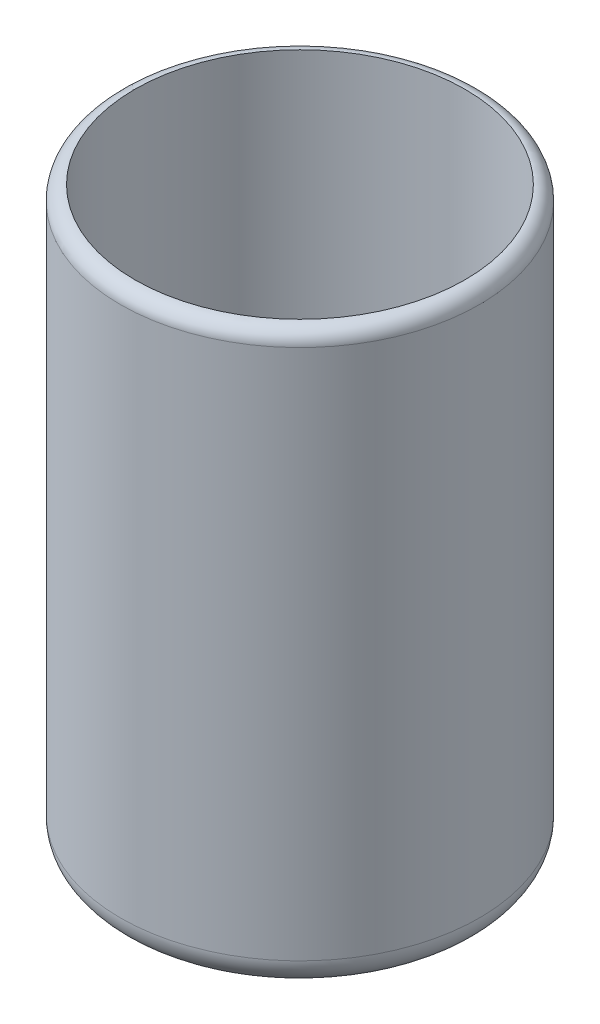
ISO-10303-21;
HEADER;
FILE_DESCRIPTION(('STEP AP214'),'2;1');
FILE_NAME('part.step','',(''),(''),'','','');
FILE_SCHEMA(('AUTOMOTIVE_DESIGN { 1 0 10303 214 1 1 1 1 }'));
ENDSEC;
DATA;
#1=APPLICATION_CONTEXT('core data for automotive mechanical design processes');
#2=APPLICATION_PROTOCOL_DEFINITION('international standard','automotive_design',2000,#1);
#3=PRODUCT_CONTEXT('',#1,'mechanical');
#4=PRODUCT('Part','Part','',(#3));
#5=PRODUCT_RELATED_PRODUCT_CATEGORY('part','',(#4));
#6=PRODUCT_DEFINITION_FORMATION('','',#4);
#7=PRODUCT_DEFINITION_CONTEXT('part definition',#1,'design');
#8=PRODUCT_DEFINITION('design','',#6,#7);
#9=PRODUCT_DEFINITION_SHAPE('','',#8);
#10=(LENGTH_UNIT() NAMED_UNIT(*) SI_UNIT(.MILLI.,.METRE.));
#11=(NAMED_UNIT(*) PLANE_ANGLE_UNIT() SI_UNIT($,.RADIAN.));
#12=(NAMED_UNIT(*) SI_UNIT($,.STERADIAN.) SOLID_ANGLE_UNIT());
#13=UNCERTAINTY_MEASURE_WITH_UNIT(LENGTH_MEASURE(1.E-05),#10,'distance_accuracy_value','');
#14=(GEOMETRIC_REPRESENTATION_CONTEXT(3) GLOBAL_UNCERTAINTY_ASSIGNED_CONTEXT((#13)) GLOBAL_UNIT_ASSIGNED_CONTEXT((#10,
#11,#12)) REPRESENTATION_CONTEXT('',''));
#15=CARTESIAN_POINT('',(0.,0.,0.));
#16=DIRECTION('',(0.,0.,1.));
#17=DIRECTION('',(1.,0.,0.));
#18=AXIS2_PLACEMENT_3D('',#15,#16,#17);
#19=CARTESIAN_POINT('',(0.,39.,0.));
#20=DIRECTION('',(0.,1.,0.));
#21=DIRECTION('',(0.,0.,1.));
#22=AXIS2_PLACEMENT_3D('',#19,#20,#21);
#23=TOROIDAL_SURFACE('',#22,11.5,1.);
#24=CARTESIAN_POINT('',(0.,40.,0.));
#25=DIRECTION('',(0.,1.,0.));
#26=DIRECTION('',(0.,0.,1.));
#27=AXIS2_PLACEMENT_3D('',#24,#25,#26);
#28=CIRCLE('',#27,11.5);
#29=CARTESIAN_POINT('',(0.,40.,11.5));
#30=VERTEX_POINT('',#29);
#31=EDGE_CURVE('E54',#30,#30,#28,.T.);
#32=ORIENTED_EDGE('',*,*,#31,.F.);
#33=EDGE_LOOP('',(#32));
#34=FACE_BOUND('',#33,.T.);
#35=CARTESIAN_POINT('',(0.,39.,0.));
#36=DIRECTION('',(0.,1.,0.));
#37=DIRECTION('',(0.,0.,1.));
#38=AXIS2_PLACEMENT_3D('',#35,#36,#37);
#39=CIRCLE('',#38,12.5);
#40=CARTESIAN_POINT('',(0.,39.,12.5));
#41=VERTEX_POINT('',#40);
#42=EDGE_CURVE('E10',#41,#41,#39,.F.);
#43=ORIENTED_EDGE('',*,*,#42,.F.);
#44=EDGE_LOOP('',(#43));
#45=FACE_BOUND('',#44,.T.);
#46=ADVANCED_FACE('F40',(#34,#45),#23,.T.);
#47=CARTESIAN_POINT('',(0.,40.,0.));
#48=DIRECTION('',(0.,-1.,0.));
#49=DIRECTION('',(0.,0.,-1.));
#50=AXIS2_PLACEMENT_3D('',#47,#48,#49);
#51=CYLINDRICAL_SURFACE('',#50,12.5);
#52=ORIENTED_EDGE('',*,*,#42,.T.);
#53=EDGE_LOOP('',(#52));
#54=FACE_BOUND('',#53,.T.);
#55=CARTESIAN_POINT('',(0.,2.,0.));
#56=DIRECTION('',(0.,1.,0.));
#57=DIRECTION('',(0.,0.,1.));
#58=AXIS2_PLACEMENT_3D('',#55,#56,#57);
#59=CIRCLE('',#58,12.5);
#60=CARTESIAN_POINT('',(0.,2.,12.5));
#61=VERTEX_POINT('',#60);
#62=EDGE_CURVE('E50',#61,#61,#59,.T.);
#63=ORIENTED_EDGE('',*,*,#62,.T.);
#64=EDGE_LOOP('',(#63));
#65=FACE_BOUND('',#64,.T.);
#66=ADVANCED_FACE('F76',(#54,#65),#51,.T.);
#67=CARTESIAN_POINT('',(0.,0.,0.));
#68=DIRECTION('',(0.,1.,0.));
#69=DIRECTION('',(0.,0.,1.));
#70=AXIS2_PLACEMENT_3D('',#67,#68,#69);
#71=PLANE('',#70);
#72=CARTESIAN_POINT('',(0.,0.,0.));
#73=DIRECTION('',(0.,1.,0.));
#74=DIRECTION('',(0.,0.,1.));
#75=AXIS2_PLACEMENT_3D('',#72,#73,#74);
#76=CIRCLE('',#75,10.5);
#77=CARTESIAN_POINT('',(0.,0.,10.5));
#78=VERTEX_POINT('',#77);
#79=EDGE_CURVE('E46',#78,#78,#76,.F.);
#80=ORIENTED_EDGE('',*,*,#79,.T.);
#81=EDGE_LOOP('',(#80));
#82=FACE_BOUND('',#81,.T.);
#83=ADVANCED_FACE('F67',(#82),#71,.F.);
#84=CARTESIAN_POINT('',(0.,40.,0.));
#85=DIRECTION('',(0.,-1.,0.));
#86=DIRECTION('',(0.,0.,-1.));
#87=AXIS2_PLACEMENT_3D('',#84,#85,#86);
#88=CYLINDRICAL_SURFACE('',#87,11.5);
#89=ORIENTED_EDGE('',*,*,#31,.T.);
#90=EDGE_LOOP('',(#89));
#91=FACE_BOUND('',#90,.T.);
#92=CARTESIAN_POINT('',(0.,1.,0.));
#93=DIRECTION('',(0.,1.,0.));
#94=DIRECTION('',(0.,0.,1.));
#95=AXIS2_PLACEMENT_3D('',#92,#93,#94);
#96=CIRCLE('',#95,11.5);
#97=CARTESIAN_POINT('',(0.,1.,11.5));
#98=VERTEX_POINT('',#97);
#99=EDGE_CURVE('E59',#98,#98,#96,.T.);
#100=ORIENTED_EDGE('',*,*,#99,.F.);
#101=EDGE_LOOP('',(#100));
#102=FACE_BOUND('',#101,.T.);
#103=ADVANCED_FACE('F65',(#91,#102),#88,.F.);
#104=CARTESIAN_POINT('',(0.,1.,0.));
#105=DIRECTION('',(0.,1.,0.));
#106=DIRECTION('',(0.,0.,1.));
#107=AXIS2_PLACEMENT_3D('',#104,#105,#106);
#108=PLANE('',#107);
#109=ORIENTED_EDGE('',*,*,#99,.T.);
#110=EDGE_LOOP('',(#109));
#111=FACE_BOUND('',#110,.T.);
#112=ADVANCED_FACE('F63',(#111),#108,.T.);
#113=CARTESIAN_POINT('',(0.,2.,0.));
#114=DIRECTION('',(0.,1.,0.));
#115=DIRECTION('',(0.,0.,1.));
#116=AXIS2_PLACEMENT_3D('',#113,#114,#115);
#117=TOROIDAL_SURFACE('',#116,10.5,2.);
#118=ORIENTED_EDGE('',*,*,#79,.F.);
#119=EDGE_LOOP('',(#118));
#120=FACE_BOUND('',#119,.T.);
#121=ORIENTED_EDGE('',*,*,#62,.F.);
#122=EDGE_LOOP('',(#121));
#123=FACE_BOUND('',#122,.T.);
#124=ADVANCED_FACE('F74',(#120,#123),#117,.T.);
#125=CLOSED_SHELL('',(#46,#66,#83,#103,#112,#124));
#126=MANIFOLD_SOLID_BREP('B2',#125);
#127=ADVANCED_BREP_SHAPE_REPRESENTATION('',(#18,#126),#14);
#128=SHAPE_DEFINITION_REPRESENTATION(#9,#127);
ENDSEC;
END-ISO-10303-21;
